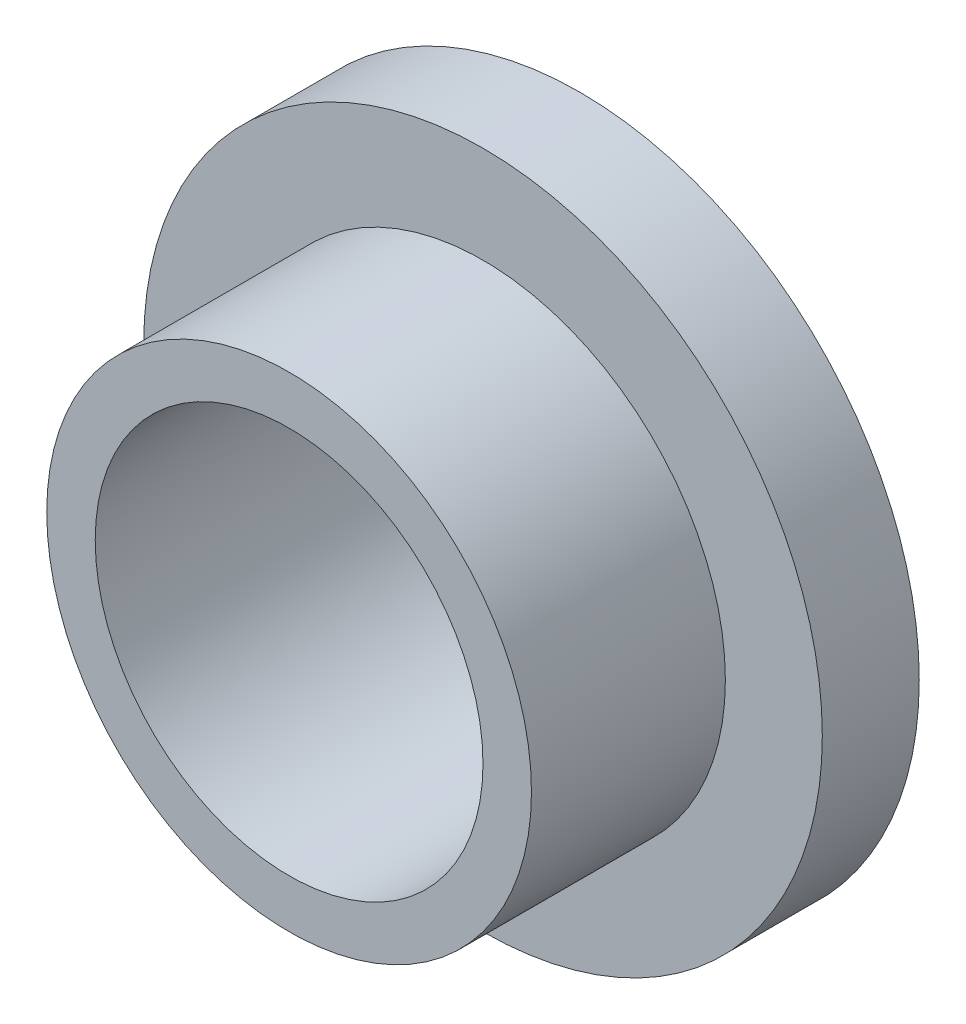
ISO-10303-21;
HEADER;
FILE_DESCRIPTION(('STEP AP214'),'2;1');
FILE_NAME('part.step','',(''),(''),'','','');
FILE_SCHEMA(('AUTOMOTIVE_DESIGN { 1 0 10303 214 1 1 1 1 }'));
ENDSEC;
DATA;
#1=APPLICATION_CONTEXT('core data for automotive mechanical design processes');
#2=APPLICATION_PROTOCOL_DEFINITION('international standard','automotive_design',2000,#1);
#3=PRODUCT_CONTEXT('',#1,'mechanical');
#4=PRODUCT('Part','Part','',(#3));
#5=PRODUCT_RELATED_PRODUCT_CATEGORY('part','',(#4));
#6=PRODUCT_DEFINITION_FORMATION('','',#4);
#7=PRODUCT_DEFINITION_CONTEXT('part definition',#1,'design');
#8=PRODUCT_DEFINITION('design','',#6,#7);
#9=PRODUCT_DEFINITION_SHAPE('','',#8);
#10=(LENGTH_UNIT() NAMED_UNIT(*) SI_UNIT(.MILLI.,.METRE.));
#11=(NAMED_UNIT(*) PLANE_ANGLE_UNIT() SI_UNIT($,.RADIAN.));
#12=(NAMED_UNIT(*) SI_UNIT($,.STERADIAN.) SOLID_ANGLE_UNIT());
#13=UNCERTAINTY_MEASURE_WITH_UNIT(LENGTH_MEASURE(1.E-05),#10,'distance_accuracy_value','');
#14=(GEOMETRIC_REPRESENTATION_CONTEXT(3) GLOBAL_UNCERTAINTY_ASSIGNED_CONTEXT((#13)) GLOBAL_UNIT_ASSIGNED_CONTEXT((#10,
#11,#12)) REPRESENTATION_CONTEXT('',''));
#15=CARTESIAN_POINT('',(0.,0.,0.));
#16=DIRECTION('',(0.,0.,1.));
#17=DIRECTION('',(1.,0.,0.));
#18=AXIS2_PLACEMENT_3D('',#15,#16,#17);
#19=CARTESIAN_POINT('',(0.,0.,5.88050706042261));
#20=DIRECTION('',(0.,0.,1.));
#21=DIRECTION('',(1.,0.,0.));
#22=AXIS2_PLACEMENT_3D('',#19,#20,#21);
#23=CYLINDRICAL_SURFACE('',#22,7.9375);
#24=CARTESIAN_POINT('',(0.,0.,4.7625));
#25=DIRECTION('',(0.,0.,1.));
#26=DIRECTION('',(1.,0.,0.));
#27=AXIS2_PLACEMENT_3D('',#24,#25,#26);
#28=CIRCLE('',#27,7.9375);
#29=CARTESIAN_POINT('',(7.9375,0.,4.7625));
#30=VERTEX_POINT('',#29);
#31=EDGE_CURVE('E57',#30,#30,#28,.T.);
#32=ORIENTED_EDGE('',*,*,#31,.F.);
#33=EDGE_LOOP('',(#32));
#34=FACE_BOUND('',#33,.T.);
#35=CARTESIAN_POINT('',(0.,0.,-1.5875));
#36=DIRECTION('',(0.,0.,-1.));
#37=DIRECTION('',(-1.,0.,0.));
#38=AXIS2_PLACEMENT_3D('',#35,#36,#37);
#39=CIRCLE('',#38,7.9375);
#40=CARTESIAN_POINT('',(-7.9375,0.,-1.5875));
#41=VERTEX_POINT('',#40);
#42=EDGE_CURVE('E10',#41,#41,#39,.T.);
#43=ORIENTED_EDGE('',*,*,#42,.F.);
#44=EDGE_LOOP('',(#43));
#45=FACE_BOUND('',#44,.T.);
#46=ADVANCED_FACE('F35',(#34,#45),#23,.T.);
#47=CARTESIAN_POINT('',(0.,7.9375,4.7625));
#48=DIRECTION('',(0.,0.,-1.));
#49=DIRECTION('',(-1.,0.,0.));
#50=AXIS2_PLACEMENT_3D('',#47,#48,#49);
#51=PLANE('',#50);
#52=CARTESIAN_POINT('',(0.,0.,4.7625));
#53=DIRECTION('',(0.,0.,1.));
#54=DIRECTION('',(1.,0.,0.));
#55=AXIS2_PLACEMENT_3D('',#52,#53,#54);
#56=CIRCLE('',#55,6.35);
#57=CARTESIAN_POINT('',(6.35,0.,4.7625));
#58=VERTEX_POINT('',#57);
#59=EDGE_CURVE('E43',#58,#58,#56,.T.);
#60=ORIENTED_EDGE('',*,*,#59,.F.);
#61=EDGE_LOOP('',(#60));
#62=FACE_BOUND('',#61,.T.);
#63=ORIENTED_EDGE('',*,*,#31,.T.);
#64=EDGE_LOOP('',(#63));
#65=FACE_BOUND('',#64,.T.);
#66=ADVANCED_FACE('F37',(#62,#65),#51,.F.);
#67=CARTESIAN_POINT('',(0.,0.,5.88050706042261));
#68=DIRECTION('',(0.,0.,1.));
#69=DIRECTION('',(1.,0.,0.));
#70=AXIS2_PLACEMENT_3D('',#67,#68,#69);
#71=CYLINDRICAL_SURFACE('',#70,6.35);
#72=CARTESIAN_POINT('',(0.,0.,-4.7625));
#73=DIRECTION('',(0.,0.,1.));
#74=DIRECTION('',(1.,0.,0.));
#75=AXIS2_PLACEMENT_3D('',#72,#73,#74);
#76=CIRCLE('',#75,6.35);
#77=CARTESIAN_POINT('',(6.35,0.,-4.7625));
#78=VERTEX_POINT('',#77);
#79=EDGE_CURVE('E51',#78,#78,#76,.T.);
#80=ORIENTED_EDGE('',*,*,#79,.F.);
#81=EDGE_LOOP('',(#80));
#82=FACE_BOUND('',#81,.T.);
#83=ORIENTED_EDGE('',*,*,#59,.T.);
#84=EDGE_LOOP('',(#83));
#85=FACE_BOUND('',#84,.T.);
#86=ADVANCED_FACE('F82',(#82,#85),#71,.F.);
#87=CARTESIAN_POINT('',(0.,7.9375,-4.7625));
#88=DIRECTION('',(0.,0.,1.));
#89=DIRECTION('',(1.,0.,0.));
#90=AXIS2_PLACEMENT_3D('',#87,#88,#89);
#91=PLANE('',#90);
#92=ORIENTED_EDGE('',*,*,#79,.T.);
#93=EDGE_LOOP('',(#92));
#94=FACE_BOUND('',#93,.T.);
#95=CARTESIAN_POINT('',(0.,0.,-4.7625));
#96=DIRECTION('',(0.,0.,1.));
#97=DIRECTION('',(1.,0.,0.));
#98=AXIS2_PLACEMENT_3D('',#95,#96,#97);
#99=CIRCLE('',#98,11.1125);
#100=CARTESIAN_POINT('',(11.1125,0.,-4.7625));
#101=VERTEX_POINT('',#100);
#102=EDGE_CURVE('E63',#101,#101,#99,.T.);
#103=ORIENTED_EDGE('',*,*,#102,.F.);
#104=EDGE_LOOP('',(#103));
#105=FACE_BOUND('',#104,.T.);
#106=ADVANCED_FACE('F77',(#94,#105),#91,.F.);
#107=CARTESIAN_POINT('',(0.,0.,11.0550230731354));
#108=DIRECTION('',(0.,0.,1.));
#109=DIRECTION('',(1.,0.,0.));
#110=AXIS2_PLACEMENT_3D('',#107,#108,#109);
#111=CYLINDRICAL_SURFACE('',#110,11.1125);
#112=CARTESIAN_POINT('',(0.,0.,-1.5875));
#113=DIRECTION('',(0.,0.,1.));
#114=DIRECTION('',(1.,0.,0.));
#115=AXIS2_PLACEMENT_3D('',#112,#113,#114);
#116=CIRCLE('',#115,11.1125);
#117=CARTESIAN_POINT('',(11.1125,0.,-1.5875));
#118=VERTEX_POINT('',#117);
#119=EDGE_CURVE('E66',#118,#118,#116,.T.);
#120=ORIENTED_EDGE('',*,*,#119,.F.);
#121=EDGE_LOOP('',(#120));
#122=FACE_BOUND('',#121,.T.);
#123=ORIENTED_EDGE('',*,*,#102,.T.);
#124=EDGE_LOOP('',(#123));
#125=FACE_BOUND('',#124,.T.);
#126=ADVANCED_FACE('F74',(#122,#125),#111,.T.);
#127=CARTESIAN_POINT('',(0.,7.9375,-1.5875));
#128=DIRECTION('',(0.,0.,-1.));
#129=DIRECTION('',(-1.,0.,0.));
#130=AXIS2_PLACEMENT_3D('',#127,#128,#129);
#131=PLANE('',#130);
#132=ORIENTED_EDGE('',*,*,#42,.T.);
#133=EDGE_LOOP('',(#132));
#134=FACE_BOUND('',#133,.T.);
#135=ORIENTED_EDGE('',*,*,#119,.T.);
#136=EDGE_LOOP('',(#135));
#137=FACE_BOUND('',#136,.T.);
#138=ADVANCED_FACE('F72',(#134,#137),#131,.F.);
#139=CLOSED_SHELL('',(#46,#66,#86,#106,#126,#138));
#140=MANIFOLD_SOLID_BREP('B2',#139);
#141=ADVANCED_BREP_SHAPE_REPRESENTATION('',(#18,#140),#14);
#142=SHAPE_DEFINITION_REPRESENTATION(#9,#141);
ENDSEC;
END-ISO-10303-21;
